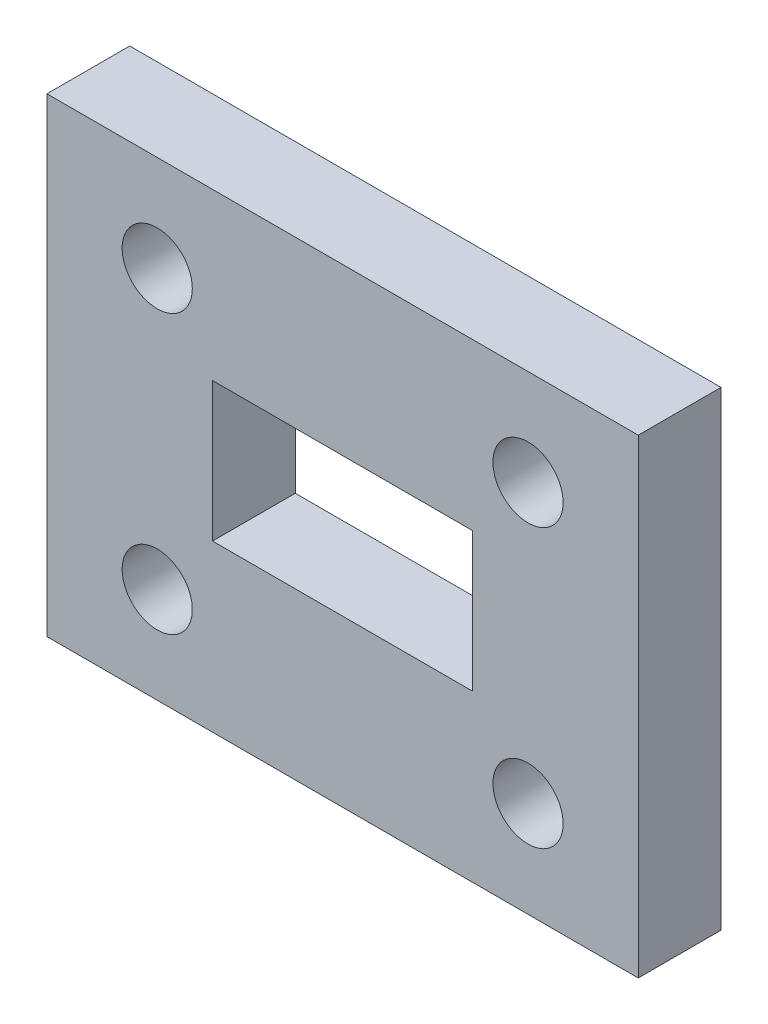
ISO-10303-21;
HEADER;
FILE_DESCRIPTION(('STEP AP214'),'2;1');
FILE_NAME('part.step','',(''),(''),'','','');
FILE_SCHEMA(('AUTOMOTIVE_DESIGN { 1 0 10303 214 1 1 1 1 }'));
ENDSEC;
DATA;
#1=APPLICATION_CONTEXT('core data for automotive mechanical design processes');
#2=APPLICATION_PROTOCOL_DEFINITION('international standard','automotive_design',2000,#1);
#3=PRODUCT_CONTEXT('',#1,'mechanical');
#4=PRODUCT('Part','Part','',(#3));
#5=PRODUCT_RELATED_PRODUCT_CATEGORY('part','',(#4));
#6=PRODUCT_DEFINITION_FORMATION('','',#4);
#7=PRODUCT_DEFINITION_CONTEXT('part definition',#1,'design');
#8=PRODUCT_DEFINITION('design','',#6,#7);
#9=PRODUCT_DEFINITION_SHAPE('','',#8);
#10=(LENGTH_UNIT() NAMED_UNIT(*) SI_UNIT(.MILLI.,.METRE.));
#11=(NAMED_UNIT(*) PLANE_ANGLE_UNIT() SI_UNIT($,.RADIAN.));
#12=(NAMED_UNIT(*) SI_UNIT($,.STERADIAN.) SOLID_ANGLE_UNIT());
#13=UNCERTAINTY_MEASURE_WITH_UNIT(LENGTH_MEASURE(1.E-05),#10,'distance_accuracy_value','');
#14=(GEOMETRIC_REPRESENTATION_CONTEXT(3) GLOBAL_UNCERTAINTY_ASSIGNED_CONTEXT((#13)) GLOBAL_UNIT_ASSIGNED_CONTEXT((#10,
#11,#12)) REPRESENTATION_CONTEXT('',''));
#15=CARTESIAN_POINT('',(0.,0.,0.));
#16=DIRECTION('',(0.,0.,1.));
#17=DIRECTION('',(1.,0.,0.));
#18=AXIS2_PLACEMENT_3D('',#15,#16,#17);
#19=CARTESIAN_POINT('',(0.,0.,3.175));
#20=DIRECTION('',(0.,0.,1.));
#21=DIRECTION('',(1.,0.,0.));
#22=AXIS2_PLACEMENT_3D('',#19,#20,#21);
#23=PLANE('',#22);
#24=CARTESIAN_POINT('',(7.112,-5.334,3.175));
#25=DIRECTION('',(0.,0.,1.));
#26=DIRECTION('',(1.,0.,0.));
#27=AXIS2_PLACEMENT_3D('',#24,#25,#26);
#28=CIRCLE('',#27,1.3462);
#29=CARTESIAN_POINT('',(8.4582,-5.334,3.175));
#30=VERTEX_POINT('',#29);
#31=EDGE_CURVE('E277',#30,#30,#28,.T.);
#32=ORIENTED_EDGE('',*,*,#31,.F.);
#33=EDGE_LOOP('',(#32));
#34=FACE_BOUND('',#33,.T.);
#35=CARTESIAN_POINT('',(-7.112,5.334,3.175));
#36=DIRECTION('',(0.,0.,1.));
#37=DIRECTION('',(1.,0.,0.));
#38=AXIS2_PLACEMENT_3D('',#35,#36,#37);
#39=CIRCLE('',#38,1.3462);
#40=CARTESIAN_POINT('',(-5.7658,5.334,3.175));
#41=VERTEX_POINT('',#40);
#42=EDGE_CURVE('E140',#41,#41,#39,.T.);
#43=ORIENTED_EDGE('',*,*,#42,.F.);
#44=EDGE_LOOP('',(#43));
#45=FACE_BOUND('',#44,.T.);
#46=DIRECTION('',(0.,-1.,0.));
#47=VECTOR('',#46,1.);
#48=CARTESIAN_POINT('',(-11.3411,-9.017,3.175));
#49=LINE('',#48,#47);
#50=CARTESIAN_POINT('',(-11.3411,9.017,3.175));
#51=VERTEX_POINT('',#50);
#52=CARTESIAN_POINT('',(-11.3411,-9.017,3.175));
#53=VERTEX_POINT('',#52);
#54=EDGE_CURVE('E156',#51,#53,#49,.T.);
#55=ORIENTED_EDGE('',*,*,#54,.T.);
#56=DIRECTION('',(1.,0.,0.));
#57=VECTOR('',#56,1.);
#58=CARTESIAN_POINT('',(11.3411,-9.017,3.175));
#59=LINE('',#58,#57);
#60=CARTESIAN_POINT('',(11.3411,-9.017,3.175));
#61=VERTEX_POINT('',#60);
#62=EDGE_CURVE('E160',#53,#61,#59,.T.);
#63=ORIENTED_EDGE('',*,*,#62,.T.);
#64=DIRECTION('',(0.,1.,0.));
#65=VECTOR('',#64,1.);
#66=CARTESIAN_POINT('',(11.3411,-9.017,3.175));
#67=LINE('',#66,#65);
#68=CARTESIAN_POINT('',(11.3411,9.017,3.175));
#69=VERTEX_POINT('',#68);
#70=EDGE_CURVE('E164',#61,#69,#67,.T.);
#71=ORIENTED_EDGE('',*,*,#70,.T.);
#72=DIRECTION('',(-1.,0.,0.));
#73=VECTOR('',#72,1.);
#74=CARTESIAN_POINT('',(11.3411,9.017,3.175));
#75=LINE('',#74,#73);
#76=EDGE_CURVE('E167',#69,#51,#75,.T.);
#77=ORIENTED_EDGE('',*,*,#76,.T.);
#78=EDGE_LOOP('',(#55,#63,#71,#77));
#79=FACE_BOUND('',#78,.T.);
#80=DIRECTION('',(1.,0.,0.));
#81=VECTOR('',#80,1.);
#82=CARTESIAN_POINT('',(4.9911,-2.667,3.175));
#83=LINE('',#82,#81);
#84=CARTESIAN_POINT('',(-4.9911,-2.667,3.175));
#85=VERTEX_POINT('',#84);
#86=CARTESIAN_POINT('',(4.9911,-2.667,3.175));
#87=VERTEX_POINT('',#86);
#88=EDGE_CURVE('E114',#85,#87,#83,.T.);
#89=ORIENTED_EDGE('',*,*,#88,.F.);
#90=DIRECTION('',(0.,-1.,0.));
#91=VECTOR('',#90,1.);
#92=CARTESIAN_POINT('',(-4.9911,-2.667,3.175));
#93=LINE('',#92,#91);
#94=CARTESIAN_POINT('',(-4.9911,2.667,3.175));
#95=VERTEX_POINT('',#94);
#96=EDGE_CURVE('E105',#95,#85,#93,.T.);
#97=ORIENTED_EDGE('',*,*,#96,.F.);
#98=DIRECTION('',(-1.,0.,0.));
#99=VECTOR('',#98,1.);
#100=CARTESIAN_POINT('',(4.9911,2.667,3.175));
#101=LINE('',#100,#99);
#102=CARTESIAN_POINT('',(4.9911,2.667,3.175));
#103=VERTEX_POINT('',#102);
#104=EDGE_CURVE('E132',#103,#95,#101,.T.);
#105=ORIENTED_EDGE('',*,*,#104,.F.);
#106=DIRECTION('',(0.,1.,0.));
#107=VECTOR('',#106,1.);
#108=CARTESIAN_POINT('',(4.9911,-2.667,3.175));
#109=LINE('',#108,#107);
#110=EDGE_CURVE('E128',#87,#103,#109,.T.);
#111=ORIENTED_EDGE('',*,*,#110,.F.);
#112=EDGE_LOOP('',(#89,#97,#105,#111));
#113=FACE_BOUND('',#112,.T.);
#114=CARTESIAN_POINT('',(7.112,5.334,3.175));
#115=DIRECTION('',(0.,0.,1.));
#116=DIRECTION('',(-1.,0.,0.));
#117=AXIS2_PLACEMENT_3D('',#114,#115,#116);
#118=CIRCLE('',#117,1.3462);
#119=CARTESIAN_POINT('',(5.7658,5.334,3.175));
#120=VERTEX_POINT('',#119);
#121=EDGE_CURVE('E285',#120,#120,#118,.T.);
#122=ORIENTED_EDGE('',*,*,#121,.F.);
#123=EDGE_LOOP('',(#122));
#124=FACE_BOUND('',#123,.T.);
#125=CARTESIAN_POINT('',(-7.112,-5.334,3.175));
#126=DIRECTION('',(0.,0.,1.));
#127=DIRECTION('',(-1.,0.,0.));
#128=AXIS2_PLACEMENT_3D('',#125,#126,#127);
#129=CIRCLE('',#128,1.3462);
#130=CARTESIAN_POINT('',(-8.4582,-5.334,3.175));
#131=VERTEX_POINT('',#130);
#132=EDGE_CURVE('E266',#131,#131,#129,.T.);
#133=ORIENTED_EDGE('',*,*,#132,.F.);
#134=EDGE_LOOP('',(#133));
#135=FACE_BOUND('',#134,.T.);
#136=ADVANCED_FACE('F39',(#34,#45,#79,#113,#124,#135),#23,.T.);
#137=CARTESIAN_POINT('',(0.,0.,0.));
#138=DIRECTION('',(0.,0.,1.));
#139=DIRECTION('',(1.,0.,0.));
#140=AXIS2_PLACEMENT_3D('',#137,#138,#139);
#141=PLANE('',#140);
#142=DIRECTION('',(0.,-1.,0.));
#143=VECTOR('',#142,1.);
#144=CARTESIAN_POINT('',(-11.3411,-9.017,0.));
#145=LINE('',#144,#143);
#146=CARTESIAN_POINT('',(-11.3411,9.017,0.));
#147=VERTEX_POINT('',#146);
#148=CARTESIAN_POINT('',(-11.3411,-9.017,0.));
#149=VERTEX_POINT('',#148);
#150=EDGE_CURVE('E123',#147,#149,#145,.T.);
#151=ORIENTED_EDGE('',*,*,#150,.F.);
#152=DIRECTION('',(-1.,0.,0.));
#153=VECTOR('',#152,1.);
#154=CARTESIAN_POINT('',(11.3411,9.017,0.));
#155=LINE('',#154,#153);
#156=CARTESIAN_POINT('',(11.3411,9.017,0.));
#157=VERTEX_POINT('',#156);
#158=EDGE_CURVE('E161',#157,#147,#155,.T.);
#159=ORIENTED_EDGE('',*,*,#158,.F.);
#160=DIRECTION('',(0.,1.,0.));
#161=VECTOR('',#160,1.);
#162=CARTESIAN_POINT('',(11.3411,-9.017,0.));
#163=LINE('',#162,#161);
#164=CARTESIAN_POINT('',(11.3411,-9.017,0.));
#165=VERTEX_POINT('',#164);
#166=EDGE_CURVE('E177',#165,#157,#163,.T.);
#167=ORIENTED_EDGE('',*,*,#166,.F.);
#168=DIRECTION('',(1.,0.,0.));
#169=VECTOR('',#168,1.);
#170=CARTESIAN_POINT('',(11.3411,-9.017,0.));
#171=LINE('',#170,#169);
#172=EDGE_CURVE('E174',#149,#165,#171,.T.);
#173=ORIENTED_EDGE('',*,*,#172,.F.);
#174=EDGE_LOOP('',(#151,#159,#167,#173));
#175=FACE_BOUND('',#174,.T.);
#176=DIRECTION('',(0.,-1.,0.));
#177=VECTOR('',#176,1.);
#178=CARTESIAN_POINT('',(-4.9911,-2.667,0.));
#179=LINE('',#178,#177);
#180=CARTESIAN_POINT('',(-4.9911,2.667,0.));
#181=VERTEX_POINT('',#180);
#182=CARTESIAN_POINT('',(-4.9911,-2.667,0.));
#183=VERTEX_POINT('',#182);
#184=EDGE_CURVE('E63',#181,#183,#179,.T.);
#185=ORIENTED_EDGE('',*,*,#184,.T.);
#186=DIRECTION('',(1.,0.,0.));
#187=VECTOR('',#186,1.);
#188=CARTESIAN_POINT('',(4.9911,-2.667,0.));
#189=LINE('',#188,#187);
#190=CARTESIAN_POINT('',(4.9911,-2.667,0.));
#191=VERTEX_POINT('',#190);
#192=EDGE_CURVE('E121',#183,#191,#189,.T.);
#193=ORIENTED_EDGE('',*,*,#192,.T.);
#194=DIRECTION('',(0.,1.,0.));
#195=VECTOR('',#194,1.);
#196=CARTESIAN_POINT('',(4.9911,-2.667,0.));
#197=LINE('',#196,#195);
#198=CARTESIAN_POINT('',(4.9911,2.667,0.));
#199=VERTEX_POINT('',#198);
#200=EDGE_CURVE('E143',#191,#199,#197,.T.);
#201=ORIENTED_EDGE('',*,*,#200,.T.);
#202=DIRECTION('',(-1.,0.,0.));
#203=VECTOR('',#202,1.);
#204=CARTESIAN_POINT('',(4.9911,2.667,0.));
#205=LINE('',#204,#203);
#206=EDGE_CURVE('E115',#199,#181,#205,.T.);
#207=ORIENTED_EDGE('',*,*,#206,.T.);
#208=EDGE_LOOP('',(#185,#193,#201,#207));
#209=FACE_BOUND('',#208,.T.);
#210=CARTESIAN_POINT('',(-7.112,5.334,0.));
#211=DIRECTION('',(0.,0.,1.));
#212=DIRECTION('',(1.,0.,0.));
#213=AXIS2_PLACEMENT_3D('',#210,#211,#212);
#214=CIRCLE('',#213,1.3462);
#215=CARTESIAN_POINT('',(-5.7658,5.334,0.));
#216=VERTEX_POINT('',#215);
#217=EDGE_CURVE('E289',#216,#216,#214,.T.);
#218=ORIENTED_EDGE('',*,*,#217,.T.);
#219=EDGE_LOOP('',(#218));
#220=FACE_BOUND('',#219,.T.);
#221=CARTESIAN_POINT('',(7.112,5.334,0.));
#222=DIRECTION('',(0.,0.,1.));
#223=DIRECTION('',(-1.,0.,0.));
#224=AXIS2_PLACEMENT_3D('',#221,#222,#223);
#225=CIRCLE('',#224,1.3462);
#226=CARTESIAN_POINT('',(5.7658,5.334,0.));
#227=VERTEX_POINT('',#226);
#228=EDGE_CURVE('E281',#227,#227,#225,.T.);
#229=ORIENTED_EDGE('',*,*,#228,.T.);
#230=EDGE_LOOP('',(#229));
#231=FACE_BOUND('',#230,.T.);
#232=CARTESIAN_POINT('',(7.112,-5.334,0.));
#233=DIRECTION('',(0.,0.,1.));
#234=DIRECTION('',(1.,0.,0.));
#235=AXIS2_PLACEMENT_3D('',#232,#233,#234);
#236=CIRCLE('',#235,1.3462);
#237=CARTESIAN_POINT('',(8.4582,-5.334,0.));
#238=VERTEX_POINT('',#237);
#239=EDGE_CURVE('E274',#238,#238,#236,.T.);
#240=ORIENTED_EDGE('',*,*,#239,.T.);
#241=EDGE_LOOP('',(#240));
#242=FACE_BOUND('',#241,.T.);
#243=CARTESIAN_POINT('',(-7.112,-5.334,0.));
#244=DIRECTION('',(0.,0.,1.));
#245=DIRECTION('',(-1.,0.,0.));
#246=AXIS2_PLACEMENT_3D('',#243,#244,#245);
#247=CIRCLE('',#246,1.3462);
#248=CARTESIAN_POINT('',(-8.4582,-5.334,0.));
#249=VERTEX_POINT('',#248);
#250=EDGE_CURVE('E269',#249,#249,#247,.T.);
#251=ORIENTED_EDGE('',*,*,#250,.T.);
#252=EDGE_LOOP('',(#251));
#253=FACE_BOUND('',#252,.T.);
#254=ADVANCED_FACE('F200',(#175,#209,#220,#231,#242,#253),#141,.F.);
#255=CARTESIAN_POINT('',(-11.3411,-9.017,3.175));
#256=DIRECTION('',(1.,0.,0.));
#257=DIRECTION('',(0.,0.,-1.));
#258=AXIS2_PLACEMENT_3D('',#255,#256,#257);
#259=PLANE('',#258);
#260=ORIENTED_EDGE('',*,*,#150,.T.);
#261=DIRECTION('',(0.,0.,-1.));
#262=VECTOR('',#261,1.);
#263=CARTESIAN_POINT('',(-11.3411,-9.017,3.175));
#264=LINE('',#263,#262);
#265=EDGE_CURVE('E11',#53,#149,#264,.T.);
#266=ORIENTED_EDGE('',*,*,#265,.F.);
#267=ORIENTED_EDGE('',*,*,#54,.F.);
#268=DIRECTION('',(0.,0.,-1.));
#269=VECTOR('',#268,1.);
#270=CARTESIAN_POINT('',(-11.3411,9.017,3.175));
#271=LINE('',#270,#269);
#272=EDGE_CURVE('E170',#51,#147,#271,.T.);
#273=ORIENTED_EDGE('',*,*,#272,.T.);
#274=EDGE_LOOP('',(#260,#266,#267,#273));
#275=FACE_BOUND('',#274,.T.);
#276=ADVANCED_FACE('F41',(#275),#259,.F.);
#277=CARTESIAN_POINT('',(11.3411,-9.017,3.175));
#278=DIRECTION('',(0.,1.,0.));
#279=DIRECTION('',(-1.,0.,0.));
#280=AXIS2_PLACEMENT_3D('',#277,#278,#279);
#281=PLANE('',#280);
#282=ORIENTED_EDGE('',*,*,#172,.T.);
#283=DIRECTION('',(0.,0.,-1.));
#284=VECTOR('',#283,1.);
#285=CARTESIAN_POINT('',(11.3411,-9.017,3.175));
#286=LINE('',#285,#284);
#287=EDGE_CURVE('E48',#61,#165,#286,.T.);
#288=ORIENTED_EDGE('',*,*,#287,.F.);
#289=ORIENTED_EDGE('',*,*,#62,.F.);
#290=ORIENTED_EDGE('',*,*,#265,.T.);
#291=EDGE_LOOP('',(#282,#288,#289,#290));
#292=FACE_BOUND('',#291,.T.);
#293=ADVANCED_FACE('F210',(#292),#281,.F.);
#294=CARTESIAN_POINT('',(11.3411,-9.017,3.175));
#295=DIRECTION('',(-1.,0.,0.));
#296=DIRECTION('',(0.,0.,1.));
#297=AXIS2_PLACEMENT_3D('',#294,#295,#296);
#298=PLANE('',#297);
#299=ORIENTED_EDGE('',*,*,#166,.T.);
#300=DIRECTION('',(0.,0.,-1.));
#301=VECTOR('',#300,1.);
#302=CARTESIAN_POINT('',(11.3411,9.017,3.175));
#303=LINE('',#302,#301);
#304=EDGE_CURVE('E185',#69,#157,#303,.T.);
#305=ORIENTED_EDGE('',*,*,#304,.F.);
#306=ORIENTED_EDGE('',*,*,#70,.F.);
#307=ORIENTED_EDGE('',*,*,#287,.T.);
#308=EDGE_LOOP('',(#299,#305,#306,#307));
#309=FACE_BOUND('',#308,.T.);
#310=ADVANCED_FACE('F194',(#309),#298,.F.);
#311=CARTESIAN_POINT('',(11.3411,9.017,3.175));
#312=DIRECTION('',(0.,-1.,0.));
#313=DIRECTION('',(1.,0.,0.));
#314=AXIS2_PLACEMENT_3D('',#311,#312,#313);
#315=PLANE('',#314);
#316=ORIENTED_EDGE('',*,*,#158,.T.);
#317=ORIENTED_EDGE('',*,*,#272,.F.);
#318=ORIENTED_EDGE('',*,*,#76,.F.);
#319=ORIENTED_EDGE('',*,*,#304,.T.);
#320=EDGE_LOOP('',(#316,#317,#318,#319));
#321=FACE_BOUND('',#320,.T.);
#322=ADVANCED_FACE('F204',(#321),#315,.F.);
#323=CARTESIAN_POINT('',(-4.9911,-2.667,3.175));
#324=DIRECTION('',(1.,0.,0.));
#325=DIRECTION('',(0.,0.,-1.));
#326=AXIS2_PLACEMENT_3D('',#323,#324,#325);
#327=PLANE('',#326);
#328=ORIENTED_EDGE('',*,*,#184,.F.);
#329=DIRECTION('',(0.,0.,-1.));
#330=VECTOR('',#329,1.);
#331=CARTESIAN_POINT('',(-4.9911,2.667,3.175));
#332=LINE('',#331,#330);
#333=EDGE_CURVE('E109',#95,#181,#332,.T.);
#334=ORIENTED_EDGE('',*,*,#333,.F.);
#335=ORIENTED_EDGE('',*,*,#96,.T.);
#336=DIRECTION('',(0.,0.,-1.));
#337=VECTOR('',#336,1.);
#338=CARTESIAN_POINT('',(-4.9911,-2.667,3.175));
#339=LINE('',#338,#337);
#340=EDGE_CURVE('E108',#85,#183,#339,.T.);
#341=ORIENTED_EDGE('',*,*,#340,.T.);
#342=EDGE_LOOP('',(#328,#334,#335,#341));
#343=FACE_BOUND('',#342,.T.);
#344=ADVANCED_FACE('F107',(#343),#327,.T.);
#345=CARTESIAN_POINT('',(4.9911,-2.667,3.175));
#346=DIRECTION('',(0.,1.,0.));
#347=DIRECTION('',(-1.,0.,0.));
#348=AXIS2_PLACEMENT_3D('',#345,#346,#347);
#349=PLANE('',#348);
#350=ORIENTED_EDGE('',*,*,#192,.F.);
#351=ORIENTED_EDGE('',*,*,#340,.F.);
#352=ORIENTED_EDGE('',*,*,#88,.T.);
#353=DIRECTION('',(0.,0.,-1.));
#354=VECTOR('',#353,1.);
#355=CARTESIAN_POINT('',(4.9911,-2.667,3.175));
#356=LINE('',#355,#354);
#357=EDGE_CURVE('E124',#87,#191,#356,.T.);
#358=ORIENTED_EDGE('',*,*,#357,.T.);
#359=EDGE_LOOP('',(#350,#351,#352,#358));
#360=FACE_BOUND('',#359,.T.);
#361=ADVANCED_FACE('F118',(#360),#349,.T.);
#362=CARTESIAN_POINT('',(4.9911,-2.667,3.175));
#363=DIRECTION('',(-1.,0.,0.));
#364=DIRECTION('',(0.,0.,1.));
#365=AXIS2_PLACEMENT_3D('',#362,#363,#364);
#366=PLANE('',#365);
#367=ORIENTED_EDGE('',*,*,#200,.F.);
#368=ORIENTED_EDGE('',*,*,#357,.F.);
#369=ORIENTED_EDGE('',*,*,#110,.T.);
#370=DIRECTION('',(0.,0.,-1.));
#371=VECTOR('',#370,1.);
#372=CARTESIAN_POINT('',(4.9911,2.667,3.175));
#373=LINE('',#372,#371);
#374=EDGE_CURVE('E55',#103,#199,#373,.T.);
#375=ORIENTED_EDGE('',*,*,#374,.T.);
#376=EDGE_LOOP('',(#367,#368,#369,#375));
#377=FACE_BOUND('',#376,.T.);
#378=ADVANCED_FACE('F236',(#377),#366,.T.);
#379=CARTESIAN_POINT('',(4.9911,2.667,3.175));
#380=DIRECTION('',(0.,-1.,0.));
#381=DIRECTION('',(1.,0.,0.));
#382=AXIS2_PLACEMENT_3D('',#379,#380,#381);
#383=PLANE('',#382);
#384=ORIENTED_EDGE('',*,*,#206,.F.);
#385=ORIENTED_EDGE('',*,*,#374,.F.);
#386=ORIENTED_EDGE('',*,*,#104,.T.);
#387=ORIENTED_EDGE('',*,*,#333,.T.);
#388=EDGE_LOOP('',(#384,#385,#386,#387));
#389=FACE_BOUND('',#388,.T.);
#390=ADVANCED_FACE('F240',(#389),#383,.T.);
#391=CARTESIAN_POINT('',(-7.112,5.334,3.175));
#392=DIRECTION('',(0.,0.,-1.));
#393=DIRECTION('',(-1.,0.,0.));
#394=AXIS2_PLACEMENT_3D('',#391,#392,#393);
#395=CYLINDRICAL_SURFACE('',#394,1.3462);
#396=ORIENTED_EDGE('',*,*,#42,.T.);
#397=EDGE_LOOP('',(#396));
#398=FACE_BOUND('',#397,.T.);
#399=ORIENTED_EDGE('',*,*,#217,.F.);
#400=EDGE_LOOP('',(#399));
#401=FACE_BOUND('',#400,.T.);
#402=ADVANCED_FACE('F246',(#398,#401),#395,.F.);
#403=CARTESIAN_POINT('',(7.112,5.334,3.175));
#404=DIRECTION('',(0.,0.,-1.));
#405=DIRECTION('',(-1.,0.,0.));
#406=AXIS2_PLACEMENT_3D('',#403,#404,#405);
#407=CYLINDRICAL_SURFACE('',#406,1.3462);
#408=ORIENTED_EDGE('',*,*,#121,.T.);
#409=EDGE_LOOP('',(#408));
#410=FACE_BOUND('',#409,.T.);
#411=ORIENTED_EDGE('',*,*,#228,.F.);
#412=EDGE_LOOP('',(#411));
#413=FACE_BOUND('',#412,.T.);
#414=ADVANCED_FACE('F249',(#410,#413),#407,.F.);
#415=CARTESIAN_POINT('',(7.112,-5.334,3.175));
#416=DIRECTION('',(0.,0.,-1.));
#417=DIRECTION('',(-1.,0.,0.));
#418=AXIS2_PLACEMENT_3D('',#415,#416,#417);
#419=CYLINDRICAL_SURFACE('',#418,1.3462);
#420=ORIENTED_EDGE('',*,*,#31,.T.);
#421=EDGE_LOOP('',(#420));
#422=FACE_BOUND('',#421,.T.);
#423=ORIENTED_EDGE('',*,*,#239,.F.);
#424=EDGE_LOOP('',(#423));
#425=FACE_BOUND('',#424,.T.);
#426=ADVANCED_FACE('F253',(#422,#425),#419,.F.);
#427=CARTESIAN_POINT('',(-7.112,-5.334,3.175));
#428=DIRECTION('',(0.,0.,-1.));
#429=DIRECTION('',(-1.,0.,0.));
#430=AXIS2_PLACEMENT_3D('',#427,#428,#429);
#431=CYLINDRICAL_SURFACE('',#430,1.3462);
#432=ORIENTED_EDGE('',*,*,#132,.T.);
#433=EDGE_LOOP('',(#432));
#434=FACE_BOUND('',#433,.T.);
#435=ORIENTED_EDGE('',*,*,#250,.F.);
#436=EDGE_LOOP('',(#435));
#437=FACE_BOUND('',#436,.T.);
#438=ADVANCED_FACE('F257',(#434,#437),#431,.F.);
#439=CLOSED_SHELL('',(#136,#254,#276,#293,#310,#322,#344,#361,#378,#390,#402,#414,#426,#438));
#440=MANIFOLD_SOLID_BREP('B2',#439);
#441=ADVANCED_BREP_SHAPE_REPRESENTATION('',(#18,#440),#14);
#442=SHAPE_DEFINITION_REPRESENTATION(#9,#441);
ENDSEC;
END-ISO-10303-21;
